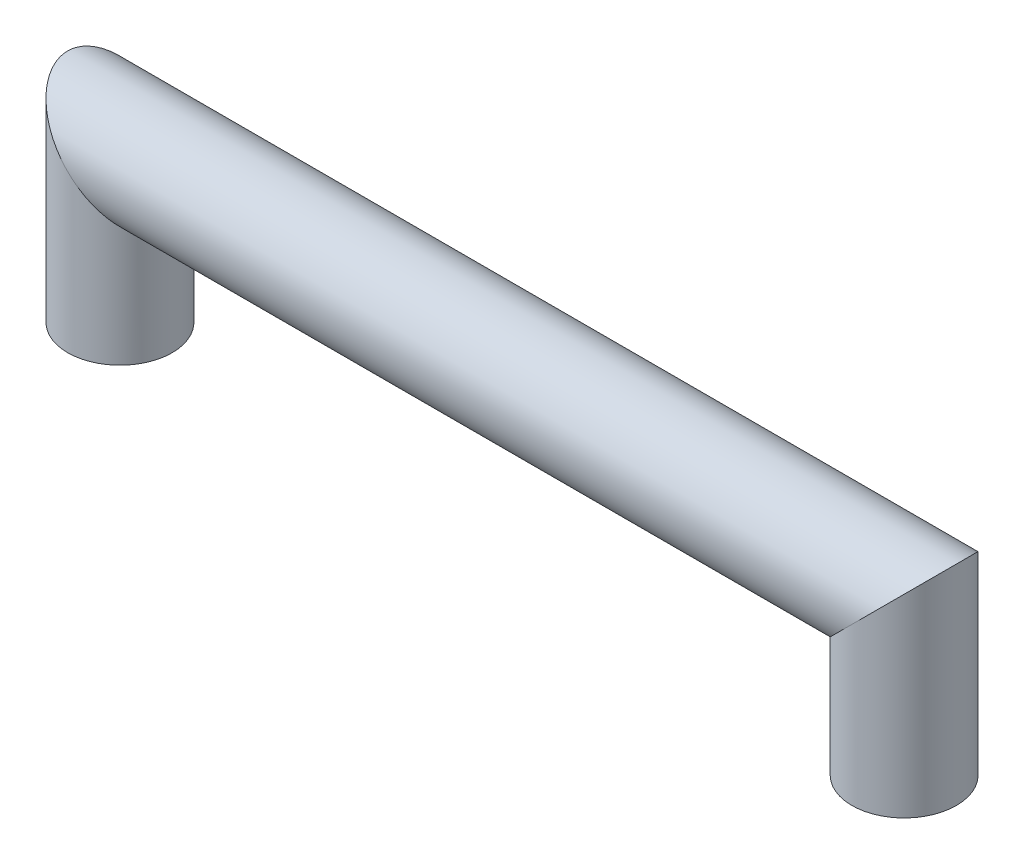
ISO-10303-21;
HEADER;
FILE_DESCRIPTION(('STEP AP214'),'2;1');
FILE_NAME('part.step','',(''),(''),'','','');
FILE_SCHEMA(('AUTOMOTIVE_DESIGN { 1 0 10303 214 1 1 1 1 }'));
ENDSEC;
DATA;
#1=APPLICATION_CONTEXT('core data for automotive mechanical design processes');
#2=APPLICATION_PROTOCOL_DEFINITION('international standard','automotive_design',2000,#1);
#3=PRODUCT_CONTEXT('',#1,'mechanical');
#4=PRODUCT('Part','Part','',(#3));
#5=PRODUCT_RELATED_PRODUCT_CATEGORY('part','',(#4));
#6=PRODUCT_DEFINITION_FORMATION('','',#4);
#7=PRODUCT_DEFINITION_CONTEXT('part definition',#1,'design');
#8=PRODUCT_DEFINITION('design','',#6,#7);
#9=PRODUCT_DEFINITION_SHAPE('','',#8);
#10=(LENGTH_UNIT() NAMED_UNIT(*) SI_UNIT(.MILLI.,.METRE.));
#11=(NAMED_UNIT(*) PLANE_ANGLE_UNIT() SI_UNIT($,.RADIAN.));
#12=(NAMED_UNIT(*) SI_UNIT($,.STERADIAN.) SOLID_ANGLE_UNIT());
#13=UNCERTAINTY_MEASURE_WITH_UNIT(LENGTH_MEASURE(1.E-05),#10,'distance_accuracy_value','');
#14=(GEOMETRIC_REPRESENTATION_CONTEXT(3) GLOBAL_UNCERTAINTY_ASSIGNED_CONTEXT((#13)) GLOBAL_UNIT_ASSIGNED_CONTEXT((#10,
#11,#12)) REPRESENTATION_CONTEXT('',''));
#15=CARTESIAN_POINT('',(0.,0.,0.));
#16=DIRECTION('',(0.,0.,1.));
#17=DIRECTION('',(1.,0.,0.));
#18=AXIS2_PLACEMENT_3D('',#15,#16,#17);
#19=CARTESIAN_POINT('',(7.5,3.,0.));
#20=DIRECTION('',(0.,-1.,0.));
#21=DIRECTION('',(1.,0.,0.));
#22=AXIS2_PLACEMENT_3D('',#19,#20,#21);
#23=CYLINDRICAL_SURFACE('',#22,1.);
#24=CARTESIAN_POINT('',(7.5,3.,0.));
#25=DIRECTION('',(0.707106781186547,-0.707106781186548,0.));
#26=DIRECTION('',(0.707106781186548,0.707106781186547,0.));
#27=AXIS2_PLACEMENT_3D('',#24,#25,#26);
#28=ELLIPSE('',#27,1.41421356237309,1.);
#29=CARTESIAN_POINT('',(8.5,4.,0.));
#30=VERTEX_POINT('',#29);
#31=EDGE_CURVE('E39',#30,#30,#28,.F.);
#32=ORIENTED_EDGE('',*,*,#31,.F.);
#33=EDGE_LOOP('',(#32));
#34=FACE_BOUND('',#33,.T.);
#35=CARTESIAN_POINT('',(7.5,0.,0.));
#36=DIRECTION('',(0.,-1.,0.));
#37=DIRECTION('',(1.,0.,0.));
#38=AXIS2_PLACEMENT_3D('',#35,#36,#37);
#39=CIRCLE('',#38,1.);
#40=CARTESIAN_POINT('',(8.5,0.,0.));
#41=VERTEX_POINT('',#40);
#42=EDGE_CURVE('E11',#41,#41,#39,.T.);
#43=ORIENTED_EDGE('',*,*,#42,.F.);
#44=EDGE_LOOP('',(#43));
#45=FACE_BOUND('',#44,.T.);
#46=ADVANCED_FACE('F33',(#34,#45),#23,.T.);
#47=CARTESIAN_POINT('',(-7.5,3.,0.));
#48=DIRECTION('',(1.,0.,0.));
#49=DIRECTION('',(0.,0.,-1.));
#50=AXIS2_PLACEMENT_3D('',#47,#48,#49);
#51=CYLINDRICAL_SURFACE('',#50,1.);
#52=CARTESIAN_POINT('',(-7.5,3.,0.));
#53=DIRECTION('',(0.707106781186548,0.707106781186548,0.));
#54=DIRECTION('',(0.707106781186548,-0.707106781186548,0.));
#55=AXIS2_PLACEMENT_3D('',#52,#53,#54);
#56=ELLIPSE('',#55,1.41421356237309,1.);
#57=CARTESIAN_POINT('',(-6.5,2.,0.));
#58=VERTEX_POINT('',#57);
#59=EDGE_CURVE('E43',#58,#58,#56,.T.);
#60=ORIENTED_EDGE('',*,*,#59,.T.);
#61=EDGE_LOOP('',(#60));
#62=FACE_BOUND('',#61,.T.);
#63=ORIENTED_EDGE('',*,*,#31,.T.);
#64=EDGE_LOOP('',(#63));
#65=FACE_BOUND('',#64,.T.);
#66=ADVANCED_FACE('F65',(#62,#65),#51,.T.);
#67=CARTESIAN_POINT('',(-7.5,5.82842712474619,0.));
#68=DIRECTION('',(0.,-1.,0.));
#69=DIRECTION('',(0.,0.,-1.));
#70=AXIS2_PLACEMENT_3D('',#67,#68,#69);
#71=CYLINDRICAL_SURFACE('',#70,1.);
#72=CARTESIAN_POINT('',(-7.5,0.,0.));
#73=DIRECTION('',(0.,1.,0.));
#74=DIRECTION('',(0.,0.,1.));
#75=AXIS2_PLACEMENT_3D('',#72,#73,#74);
#76=CIRCLE('',#75,1.);
#77=CARTESIAN_POINT('',(-7.5,0.,1.));
#78=VERTEX_POINT('',#77);
#79=EDGE_CURVE('E47',#78,#78,#76,.T.);
#80=ORIENTED_EDGE('',*,*,#79,.T.);
#81=EDGE_LOOP('',(#80));
#82=FACE_BOUND('',#81,.T.);
#83=ORIENTED_EDGE('',*,*,#59,.F.);
#84=EDGE_LOOP('',(#83));
#85=FACE_BOUND('',#84,.T.);
#86=ADVANCED_FACE('F53',(#82,#85),#71,.T.);
#87=CARTESIAN_POINT('',(-7.5,0.,0.));
#88=DIRECTION('',(0.,1.,0.));
#89=DIRECTION('',(0.,0.,1.));
#90=AXIS2_PLACEMENT_3D('',#87,#88,#89);
#91=PLANE('',#90);
#92=ORIENTED_EDGE('',*,*,#79,.F.);
#93=EDGE_LOOP('',(#92));
#94=FACE_BOUND('',#93,.T.);
#95=ADVANCED_FACE('F56',(#94),#91,.F.);
#96=CARTESIAN_POINT('',(7.5,0.,0.));
#97=DIRECTION('',(0.,-1.,0.));
#98=DIRECTION('',(1.,0.,0.));
#99=AXIS2_PLACEMENT_3D('',#96,#97,#98);
#100=PLANE('',#99);
#101=ORIENTED_EDGE('',*,*,#42,.T.);
#102=EDGE_LOOP('',(#101));
#103=FACE_BOUND('',#102,.T.);
#104=ADVANCED_FACE('F58',(#103),#100,.T.);
#105=CLOSED_SHELL('',(#46,#66,#86,#95,#104));
#106=MANIFOLD_SOLID_BREP('B2',#105);
#107=ADVANCED_BREP_SHAPE_REPRESENTATION('',(#18,#106),#14);
#108=SHAPE_DEFINITION_REPRESENTATION(#9,#107);
ENDSEC;
END-ISO-10303-21;
